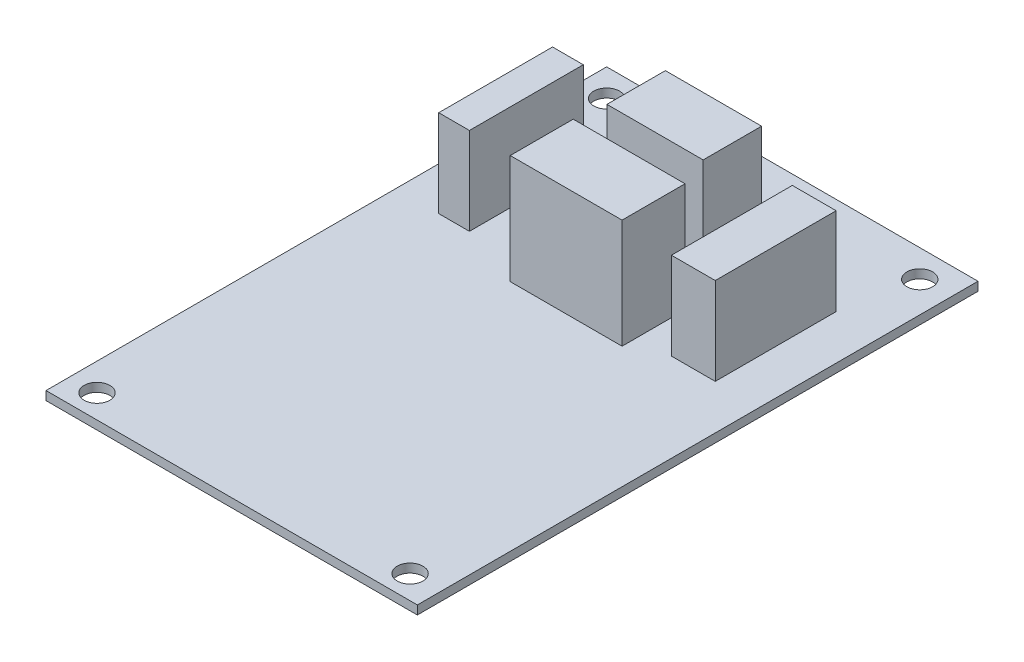
ISO-10303-21;
HEADER;
FILE_DESCRIPTION(('STEP AP214'),'2;1');
FILE_NAME('part.step','',(''),(''),'','','');
FILE_SCHEMA(('AUTOMOTIVE_DESIGN { 1 0 10303 214 1 1 1 1 }'));
ENDSEC;
DATA;
#1=APPLICATION_CONTEXT('core data for automotive mechanical design processes');
#2=APPLICATION_PROTOCOL_DEFINITION('international standard','automotive_design',2000,#1);
#3=PRODUCT_CONTEXT('',#1,'mechanical');
#4=PRODUCT('Part','Part','',(#3));
#5=PRODUCT_RELATED_PRODUCT_CATEGORY('part','',(#4));
#6=PRODUCT_DEFINITION_FORMATION('','',#4);
#7=PRODUCT_DEFINITION_CONTEXT('part definition',#1,'design');
#8=PRODUCT_DEFINITION('design','',#6,#7);
#9=PRODUCT_DEFINITION_SHAPE('','',#8);
#10=(LENGTH_UNIT() NAMED_UNIT(*) SI_UNIT(.MILLI.,.METRE.));
#11=(NAMED_UNIT(*) PLANE_ANGLE_UNIT() SI_UNIT($,.RADIAN.));
#12=(NAMED_UNIT(*) SI_UNIT($,.STERADIAN.) SOLID_ANGLE_UNIT());
#13=UNCERTAINTY_MEASURE_WITH_UNIT(LENGTH_MEASURE(1.E-05),#10,'distance_accuracy_value','');
#14=(GEOMETRIC_REPRESENTATION_CONTEXT(3) GLOBAL_UNCERTAINTY_ASSIGNED_CONTEXT((#13)) GLOBAL_UNIT_ASSIGNED_CONTEXT((#10,
#11,#12)) REPRESENTATION_CONTEXT('',''));
#15=CARTESIAN_POINT('',(0.,0.,0.));
#16=DIRECTION('',(0.,0.,1.));
#17=DIRECTION('',(1.,0.,0.));
#18=AXIS2_PLACEMENT_3D('',#15,#16,#17);
#19=CARTESIAN_POINT('',(0.,1.2,0.));
#20=DIRECTION('',(0.,1.,0.));
#21=DIRECTION('',(0.,0.,1.));
#22=AXIS2_PLACEMENT_3D('',#19,#20,#21);
#23=PLANE('',#22);
#24=CARTESIAN_POINT('',(3.77000000000073,1.2,73.77));
#25=DIRECTION('',(0.,1.,0.));
#26=DIRECTION('',(0.,0.,1.));
#27=AXIS2_PLACEMENT_3D('',#24,#25,#26);
#28=CIRCLE('',#27,1.77);
#29=CARTESIAN_POINT('',(3.77000000000073,1.2,75.54));
#30=VERTEX_POINT('',#29);
#31=EDGE_CURVE('E285',#30,#30,#28,.T.);
#32=ORIENTED_EDGE('',*,*,#31,.F.);
#33=EDGE_LOOP('',(#32));
#34=FACE_BOUND('',#33,.T.);
#35=CARTESIAN_POINT('',(46.7700000000007,1.2,73.77));
#36=DIRECTION('',(0.,1.,0.));
#37=DIRECTION('',(0.,0.,1.));
#38=AXIS2_PLACEMENT_3D('',#35,#36,#37);
#39=CIRCLE('',#38,1.77000000000001);
#40=CARTESIAN_POINT('',(46.7700000000007,1.2,75.54));
#41=VERTEX_POINT('',#40);
#42=EDGE_CURVE('E296',#41,#41,#39,.T.);
#43=ORIENTED_EDGE('',*,*,#42,.F.);
#44=EDGE_LOOP('',(#43));
#45=FACE_BOUND('',#44,.T.);
#46=CARTESIAN_POINT('',(46.77,1.2,3.77));
#47=DIRECTION('',(0.,1.,0.));
#48=DIRECTION('',(0.,0.,1.));
#49=AXIS2_PLACEMENT_3D('',#46,#47,#48);
#50=CIRCLE('',#49,1.77);
#51=CARTESIAN_POINT('',(46.77,1.2,5.54));
#52=VERTEX_POINT('',#51);
#53=EDGE_CURVE('E290',#52,#52,#50,.T.);
#54=ORIENTED_EDGE('',*,*,#53,.F.);
#55=EDGE_LOOP('',(#54));
#56=FACE_BOUND('',#55,.T.);
#57=CARTESIAN_POINT('',(3.77,1.2,3.77));
#58=DIRECTION('',(0.,1.,0.));
#59=DIRECTION('',(0.,0.,1.));
#60=AXIS2_PLACEMENT_3D('',#57,#58,#59);
#61=CIRCLE('',#60,1.77);
#62=CARTESIAN_POINT('',(3.77,1.2,5.54));
#63=VERTEX_POINT('',#62);
#64=EDGE_CURVE('E289',#63,#63,#61,.T.);
#65=ORIENTED_EDGE('',*,*,#64,.F.);
#66=EDGE_LOOP('',(#65));
#67=FACE_BOUND('',#66,.T.);
#68=DIRECTION('',(0.,0.,1.));
#69=VECTOR('',#68,1.);
#70=CARTESIAN_POINT('',(0.,1.2,0.));
#71=LINE('',#70,#69);
#72=CARTESIAN_POINT('',(0.,1.2,0.));
#73=VERTEX_POINT('',#72);
#74=CARTESIAN_POINT('',(0.,1.2,77.));
#75=VERTEX_POINT('',#74);
#76=EDGE_CURVE('E310',#73,#75,#71,.T.);
#77=ORIENTED_EDGE('',*,*,#76,.T.);
#78=DIRECTION('',(1.,0.,0.));
#79=VECTOR('',#78,1.);
#80=CARTESIAN_POINT('',(0.,1.2,77.));
#81=LINE('',#80,#79);
#82=CARTESIAN_POINT('',(51.,1.2,77.));
#83=VERTEX_POINT('',#82);
#84=EDGE_CURVE('E313',#75,#83,#81,.T.);
#85=ORIENTED_EDGE('',*,*,#84,.T.);
#86=DIRECTION('',(0.,0.,-1.));
#87=VECTOR('',#86,1.);
#88=CARTESIAN_POINT('',(51.,1.2,0.));
#89=LINE('',#88,#87);
#90=CARTESIAN_POINT('',(51.,1.2,0.));
#91=VERTEX_POINT('',#90);
#92=EDGE_CURVE('E316',#83,#91,#89,.T.);
#93=ORIENTED_EDGE('',*,*,#92,.T.);
#94=DIRECTION('',(-1.,0.,0.));
#95=VECTOR('',#94,1.);
#96=CARTESIAN_POINT('',(0.,1.2,0.));
#97=LINE('',#96,#95);
#98=EDGE_CURVE('E318',#91,#73,#97,.T.);
#99=ORIENTED_EDGE('',*,*,#98,.T.);
#100=EDGE_LOOP('',(#77,#85,#93,#99));
#101=FACE_BOUND('',#100,.T.);
#102=DIRECTION('',(1.,0.,0.));
#103=VECTOR('',#102,1.);
#104=CARTESIAN_POINT('',(19.4812524808403,1.2,19.4406328559942));
#105=LINE('',#104,#103);
#106=CARTESIAN_POINT('',(19.4812524808403,1.2,19.4406328559942));
#107=VERTEX_POINT('',#106);
#108=CARTESIAN_POINT('',(32.6948246206047,1.2,19.4406328559942));
#109=VERTEX_POINT('',#108);
#110=EDGE_CURVE('E270',#107,#109,#105,.T.);
#111=ORIENTED_EDGE('',*,*,#110,.F.);
#112=DIRECTION('',(0.,0.,1.));
#113=VECTOR('',#112,1.);
#114=CARTESIAN_POINT('',(19.4812524808403,1.2,11.4156361637813));
#115=LINE('',#114,#113);
#116=CARTESIAN_POINT('',(19.4812524808403,1.2,11.4156361637813));
#117=VERTEX_POINT('',#116);
#118=EDGE_CURVE('E256',#117,#107,#115,.T.);
#119=ORIENTED_EDGE('',*,*,#118,.F.);
#120=DIRECTION('',(-1.,0.,0.));
#121=VECTOR('',#120,1.);
#122=CARTESIAN_POINT('',(19.4812524808403,1.2,11.4156361637813));
#123=LINE('',#122,#121);
#124=CARTESIAN_POINT('',(32.6948246206047,1.2,11.4156361637813));
#125=VERTEX_POINT('',#124);
#126=EDGE_CURVE('E261',#125,#117,#123,.T.);
#127=ORIENTED_EDGE('',*,*,#126,.F.);
#128=DIRECTION('',(0.,0.,-1.));
#129=VECTOR('',#128,1.);
#130=CARTESIAN_POINT('',(32.6948246206047,1.2,11.4156361637813));
#131=LINE('',#130,#129);
#132=EDGE_CURVE('E272',#109,#125,#131,.T.);
#133=ORIENTED_EDGE('',*,*,#132,.F.);
#134=EDGE_LOOP('',(#111,#119,#127,#133));
#135=FACE_BOUND('',#134,.T.);
#136=DIRECTION('',(1.,0.,0.));
#137=VECTOR('',#136,1.);
#138=CARTESIAN_POINT('',(18.9278044331014,1.2,32.1699379539872));
#139=LINE('',#138,#137);
#140=CARTESIAN_POINT('',(18.9278044331014,1.2,32.1699379539872));
#141=VERTEX_POINT('',#140);
#142=CARTESIAN_POINT('',(34.2859877578538,1.2,32.1699379539872));
#143=VERTEX_POINT('',#142);
#144=EDGE_CURVE('E241',#141,#143,#139,.T.);
#145=ORIENTED_EDGE('',*,*,#144,.F.);
#146=DIRECTION('',(0.,0.,1.));
#147=VECTOR('',#146,1.);
#148=CARTESIAN_POINT('',(18.9278044331014,1.2,23.5223122080681));
#149=LINE('',#148,#147);
#150=CARTESIAN_POINT('',(18.9278044331014,1.2,23.5223122080681));
#151=VERTEX_POINT('',#150);
#152=EDGE_CURVE('E227',#151,#141,#149,.T.);
#153=ORIENTED_EDGE('',*,*,#152,.F.);
#154=DIRECTION('',(-1.,0.,0.));
#155=VECTOR('',#154,1.);
#156=CARTESIAN_POINT('',(18.9278044331014,1.2,23.5223122080681));
#157=LINE('',#156,#155);
#158=CARTESIAN_POINT('',(34.2859877578538,1.2,23.5223122080681));
#159=VERTEX_POINT('',#158);
#160=EDGE_CURVE('E232',#159,#151,#157,.T.);
#161=ORIENTED_EDGE('',*,*,#160,.F.);
#162=DIRECTION('',(0.,0.,-1.));
#163=VECTOR('',#162,1.);
#164=CARTESIAN_POINT('',(34.2859877578538,1.2,23.5223122080681));
#165=LINE('',#164,#163);
#166=EDGE_CURVE('E243',#143,#159,#165,.T.);
#167=ORIENTED_EDGE('',*,*,#166,.F.);
#168=EDGE_LOOP('',(#145,#153,#161,#167));
#169=FACE_BOUND('',#168,.T.);
#170=DIRECTION('',(1.,0.,0.));
#171=VECTOR('',#170,1.);
#172=CARTESIAN_POINT('',(5.92177531123907,1.2,28.987611679489));
#173=LINE('',#172,#171);
#174=CARTESIAN_POINT('',(5.92177531123907,1.2,28.987611679489));
#175=VERTEX_POINT('',#174);
#176=CARTESIAN_POINT('',(10.1418166752476,1.2,28.987611679489));
#177=VERTEX_POINT('',#176);
#178=EDGE_CURVE('E199',#175,#177,#173,.T.);
#179=ORIENTED_EDGE('',*,*,#178,.F.);
#180=DIRECTION('',(0.,0.,1.));
#181=VECTOR('',#180,1.);
#182=CARTESIAN_POINT('',(5.92177531123907,1.2,13.3527043308672));
#183=LINE('',#182,#181);
#184=CARTESIAN_POINT('',(5.92177531123907,1.2,13.3527043308672));
#185=VERTEX_POINT('',#184);
#186=EDGE_CURVE('E196',#185,#175,#183,.T.);
#187=ORIENTED_EDGE('',*,*,#186,.F.);
#188=DIRECTION('',(-1.,0.,0.));
#189=VECTOR('',#188,1.);
#190=CARTESIAN_POINT('',(5.92177531123907,1.2,13.3527043308672));
#191=LINE('',#190,#189);
#192=CARTESIAN_POINT('',(10.1418166752476,1.2,13.3527043308672));
#193=VERTEX_POINT('',#192);
#194=EDGE_CURVE('E208',#193,#185,#191,.T.);
#195=ORIENTED_EDGE('',*,*,#194,.F.);
#196=DIRECTION('',(0.,0.,-1.));
#197=VECTOR('',#196,1.);
#198=CARTESIAN_POINT('',(10.1418166752476,1.2,13.3527043308672));
#199=LINE('',#198,#197);
#200=EDGE_CURVE('E216',#177,#193,#199,.T.);
#201=ORIENTED_EDGE('',*,*,#200,.F.);
#202=EDGE_LOOP('',(#179,#187,#195,#201));
#203=FACE_BOUND('',#202,.T.);
#204=DIRECTION('',(1.,0.,0.));
#205=VECTOR('',#204,1.);
#206=CARTESIAN_POINT('',(38.8519341516991,1.2,29.9561457630319));
#207=LINE('',#206,#205);
#208=CARTESIAN_POINT('',(38.8519341516991,1.2,29.9561457630319));
#209=VERTEX_POINT('',#208);
#210=CARTESIAN_POINT('',(44.8706816708589,1.2,29.9561457630319));
#211=VERTEX_POINT('',#210);
#212=EDGE_CURVE('E597',#209,#211,#207,.T.);
#213=ORIENTED_EDGE('',*,*,#212,.F.);
#214=DIRECTION('',(0.,0.,1.));
#215=VECTOR('',#214,1.);
#216=CARTESIAN_POINT('',(38.8519341516991,1.2,13.3527043308672));
#217=LINE('',#216,#215);
#218=CARTESIAN_POINT('',(38.8519341516991,1.2,13.3527043308672));
#219=VERTEX_POINT('',#218);
#220=EDGE_CURVE('E194',#219,#209,#217,.T.);
#221=ORIENTED_EDGE('',*,*,#220,.F.);
#222=DIRECTION('',(-1.,0.,0.));
#223=VECTOR('',#222,1.);
#224=CARTESIAN_POINT('',(38.8519341516991,1.2,13.3527043308672));
#225=LINE('',#224,#223);
#226=CARTESIAN_POINT('',(44.8706816708589,1.2,13.3527043308672));
#227=VERTEX_POINT('',#226);
#228=EDGE_CURVE('E190',#227,#219,#225,.T.);
#229=ORIENTED_EDGE('',*,*,#228,.F.);
#230=DIRECTION('',(0.,0.,-1.));
#231=VECTOR('',#230,1.);
#232=CARTESIAN_POINT('',(44.8706816708589,1.2,13.3527043308672));
#233=LINE('',#232,#231);
#234=EDGE_CURVE('E594',#211,#227,#233,.T.);
#235=ORIENTED_EDGE('',*,*,#234,.F.);
#236=EDGE_LOOP('',(#213,#221,#229,#235));
#237=FACE_BOUND('',#236,.T.);
#238=ADVANCED_FACE('F33',(#34,#45,#56,#67,#101,#135,#169,#203,#237),#23,.T.);
#239=CARTESIAN_POINT('',(0.,1.2,0.));
#240=DIRECTION('',(1.,0.,0.));
#241=DIRECTION('',(0.,0.,-1.));
#242=AXIS2_PLACEMENT_3D('',#239,#240,#241);
#243=PLANE('',#242);
#244=DIRECTION('',(0.,0.,1.));
#245=VECTOR('',#244,1.);
#246=CARTESIAN_POINT('',(0.,0.,0.));
#247=LINE('',#246,#245);
#248=CARTESIAN_POINT('',(0.,0.,0.));
#249=VERTEX_POINT('',#248);
#250=CARTESIAN_POINT('',(0.,0.,77.));
#251=VERTEX_POINT('',#250);
#252=EDGE_CURVE('E307',#249,#251,#247,.T.);
#253=ORIENTED_EDGE('',*,*,#252,.T.);
#254=DIRECTION('',(0.,-1.,0.));
#255=VECTOR('',#254,1.);
#256=CARTESIAN_POINT('',(0.,1.2,77.));
#257=LINE('',#256,#255);
#258=EDGE_CURVE('E11',#75,#251,#257,.T.);
#259=ORIENTED_EDGE('',*,*,#258,.F.);
#260=ORIENTED_EDGE('',*,*,#76,.F.);
#261=DIRECTION('',(0.,-1.,0.));
#262=VECTOR('',#261,1.);
#263=CARTESIAN_POINT('',(0.,1.2,0.));
#264=LINE('',#263,#262);
#265=EDGE_CURVE('E320',#73,#249,#264,.T.);
#266=ORIENTED_EDGE('',*,*,#265,.T.);
#267=EDGE_LOOP('',(#253,#259,#260,#266));
#268=FACE_BOUND('',#267,.T.);
#269=ADVANCED_FACE('F35',(#268),#243,.F.);
#270=CARTESIAN_POINT('',(0.,1.2,77.));
#271=DIRECTION('',(0.,0.,-1.));
#272=DIRECTION('',(-1.,0.,0.));
#273=AXIS2_PLACEMENT_3D('',#270,#271,#272);
#274=PLANE('',#273);
#275=DIRECTION('',(1.,0.,0.));
#276=VECTOR('',#275,1.);
#277=CARTESIAN_POINT('',(0.,0.,77.));
#278=LINE('',#277,#276);
#279=CARTESIAN_POINT('',(51.,0.,77.));
#280=VERTEX_POINT('',#279);
#281=EDGE_CURVE('E323',#251,#280,#278,.T.);
#282=ORIENTED_EDGE('',*,*,#281,.T.);
#283=DIRECTION('',(0.,-1.,0.));
#284=VECTOR('',#283,1.);
#285=CARTESIAN_POINT('',(51.,1.2,77.));
#286=LINE('',#285,#284);
#287=EDGE_CURVE('E41',#83,#280,#286,.T.);
#288=ORIENTED_EDGE('',*,*,#287,.F.);
#289=ORIENTED_EDGE('',*,*,#84,.F.);
#290=ORIENTED_EDGE('',*,*,#258,.T.);
#291=EDGE_LOOP('',(#282,#288,#289,#290));
#292=FACE_BOUND('',#291,.T.);
#293=ADVANCED_FACE('F353',(#292),#274,.F.);
#294=CARTESIAN_POINT('',(51.,1.2,0.));
#295=DIRECTION('',(-1.,0.,0.));
#296=DIRECTION('',(0.,0.,1.));
#297=AXIS2_PLACEMENT_3D('',#294,#295,#296);
#298=PLANE('',#297);
#299=DIRECTION('',(0.,0.,-1.));
#300=VECTOR('',#299,1.);
#301=CARTESIAN_POINT('',(51.,0.,0.));
#302=LINE('',#301,#300);
#303=CARTESIAN_POINT('',(51.,0.,0.));
#304=VERTEX_POINT('',#303);
#305=EDGE_CURVE('E325',#280,#304,#302,.T.);
#306=ORIENTED_EDGE('',*,*,#305,.T.);
#307=DIRECTION('',(0.,-1.,0.));
#308=VECTOR('',#307,1.);
#309=CARTESIAN_POINT('',(51.,1.2,0.));
#310=LINE('',#309,#308);
#311=EDGE_CURVE('E330',#91,#304,#310,.T.);
#312=ORIENTED_EDGE('',*,*,#311,.F.);
#313=ORIENTED_EDGE('',*,*,#92,.F.);
#314=ORIENTED_EDGE('',*,*,#287,.T.);
#315=EDGE_LOOP('',(#306,#312,#313,#314));
#316=FACE_BOUND('',#315,.T.);
#317=ADVANCED_FACE('F337',(#316),#298,.F.);
#318=CARTESIAN_POINT('',(0.,1.2,0.));
#319=DIRECTION('',(0.,0.,1.));
#320=DIRECTION('',(1.,0.,0.));
#321=AXIS2_PLACEMENT_3D('',#318,#319,#320);
#322=PLANE('',#321);
#323=DIRECTION('',(-1.,0.,0.));
#324=VECTOR('',#323,1.);
#325=CARTESIAN_POINT('',(0.,0.,0.));
#326=LINE('',#325,#324);
#327=EDGE_CURVE('E314',#304,#249,#326,.T.);
#328=ORIENTED_EDGE('',*,*,#327,.T.);
#329=ORIENTED_EDGE('',*,*,#265,.F.);
#330=ORIENTED_EDGE('',*,*,#98,.F.);
#331=ORIENTED_EDGE('',*,*,#311,.T.);
#332=EDGE_LOOP('',(#328,#329,#330,#331));
#333=FACE_BOUND('',#332,.T.);
#334=ADVANCED_FACE('F346',(#333),#322,.F.);
#335=CARTESIAN_POINT('',(0.,0.,0.));
#336=DIRECTION('',(0.,1.,0.));
#337=DIRECTION('',(0.,0.,1.));
#338=AXIS2_PLACEMENT_3D('',#335,#336,#337);
#339=PLANE('',#338);
#340=CARTESIAN_POINT('',(3.77000000000073,0.,73.77));
#341=DIRECTION('',(0.,1.,0.));
#342=DIRECTION('',(0.,0.,1.));
#343=AXIS2_PLACEMENT_3D('',#340,#341,#342);
#344=CIRCLE('',#343,1.77);
#345=CARTESIAN_POINT('',(3.77000000000073,0.,75.54));
#346=VERTEX_POINT('',#345);
#347=EDGE_CURVE('E299',#346,#346,#344,.T.);
#348=ORIENTED_EDGE('',*,*,#347,.T.);
#349=EDGE_LOOP('',(#348));
#350=FACE_BOUND('',#349,.T.);
#351=CARTESIAN_POINT('',(46.7700000000007,0.,73.77));
#352=DIRECTION('',(0.,1.,0.));
#353=DIRECTION('',(0.,0.,1.));
#354=AXIS2_PLACEMENT_3D('',#351,#352,#353);
#355=CIRCLE('',#354,1.77000000000001);
#356=CARTESIAN_POINT('',(46.7700000000007,0.,75.54));
#357=VERTEX_POINT('',#356);
#358=EDGE_CURVE('E293',#357,#357,#355,.T.);
#359=ORIENTED_EDGE('',*,*,#358,.T.);
#360=EDGE_LOOP('',(#359));
#361=FACE_BOUND('',#360,.T.);
#362=CARTESIAN_POINT('',(46.77,0.,3.77));
#363=DIRECTION('',(0.,1.,0.));
#364=DIRECTION('',(0.,0.,1.));
#365=AXIS2_PLACEMENT_3D('',#362,#363,#364);
#366=CIRCLE('',#365,1.77);
#367=CARTESIAN_POINT('',(46.77,0.,5.54));
#368=VERTEX_POINT('',#367);
#369=EDGE_CURVE('E286',#368,#368,#366,.T.);
#370=ORIENTED_EDGE('',*,*,#369,.T.);
#371=EDGE_LOOP('',(#370));
#372=FACE_BOUND('',#371,.T.);
#373=CARTESIAN_POINT('',(3.77,0.,3.77));
#374=DIRECTION('',(0.,1.,0.));
#375=DIRECTION('',(0.,0.,1.));
#376=AXIS2_PLACEMENT_3D('',#373,#374,#375);
#377=CIRCLE('',#376,1.77);
#378=CARTESIAN_POINT('',(3.77,0.,5.54));
#379=VERTEX_POINT('',#378);
#380=EDGE_CURVE('E304',#379,#379,#377,.T.);
#381=ORIENTED_EDGE('',*,*,#380,.T.);
#382=EDGE_LOOP('',(#381));
#383=FACE_BOUND('',#382,.T.);
#384=ORIENTED_EDGE('',*,*,#252,.F.);
#385=ORIENTED_EDGE('',*,*,#327,.F.);
#386=ORIENTED_EDGE('',*,*,#305,.F.);
#387=ORIENTED_EDGE('',*,*,#281,.F.);
#388=EDGE_LOOP('',(#384,#385,#386,#387));
#389=FACE_BOUND('',#388,.T.);
#390=ADVANCED_FACE('F343',(#350,#361,#372,#383,#389),#339,.F.);
#391=CARTESIAN_POINT('',(3.77,0.,3.77));
#392=DIRECTION('',(0.,1.,0.));
#393=DIRECTION('',(0.,0.,1.));
#394=AXIS2_PLACEMENT_3D('',#391,#392,#393);
#395=CYLINDRICAL_SURFACE('',#394,1.77);
#396=ORIENTED_EDGE('',*,*,#380,.F.);
#397=EDGE_LOOP('',(#396));
#398=FACE_BOUND('',#397,.T.);
#399=ORIENTED_EDGE('',*,*,#64,.T.);
#400=EDGE_LOOP('',(#399));
#401=FACE_BOUND('',#400,.T.);
#402=ADVANCED_FACE('F371',(#398,#401),#395,.F.);
#403=CARTESIAN_POINT('',(46.77,0.,3.77));
#404=DIRECTION('',(0.,1.,0.));
#405=DIRECTION('',(0.,0.,1.));
#406=AXIS2_PLACEMENT_3D('',#403,#404,#405);
#407=CYLINDRICAL_SURFACE('',#406,1.77);
#408=ORIENTED_EDGE('',*,*,#369,.F.);
#409=EDGE_LOOP('',(#408));
#410=FACE_BOUND('',#409,.T.);
#411=ORIENTED_EDGE('',*,*,#53,.T.);
#412=EDGE_LOOP('',(#411));
#413=FACE_BOUND('',#412,.T.);
#414=ADVANCED_FACE('F391',(#410,#413),#407,.F.);
#415=CARTESIAN_POINT('',(46.7700000000007,0.,73.77));
#416=DIRECTION('',(0.,1.,0.));
#417=DIRECTION('',(0.,0.,1.));
#418=AXIS2_PLACEMENT_3D('',#415,#416,#417);
#419=CYLINDRICAL_SURFACE('',#418,1.77000000000001);
#420=ORIENTED_EDGE('',*,*,#358,.F.);
#421=EDGE_LOOP('',(#420));
#422=FACE_BOUND('',#421,.T.);
#423=ORIENTED_EDGE('',*,*,#42,.T.);
#424=EDGE_LOOP('',(#423));
#425=FACE_BOUND('',#424,.T.);
#426=ADVANCED_FACE('F398',(#422,#425),#419,.F.);
#427=CARTESIAN_POINT('',(3.77000000000073,0.,73.77));
#428=DIRECTION('',(0.,1.,0.));
#429=DIRECTION('',(0.,0.,1.));
#430=AXIS2_PLACEMENT_3D('',#427,#428,#429);
#431=CYLINDRICAL_SURFACE('',#430,1.77);
#432=ORIENTED_EDGE('',*,*,#347,.F.);
#433=EDGE_LOOP('',(#432));
#434=FACE_BOUND('',#433,.T.);
#435=ORIENTED_EDGE('',*,*,#31,.T.);
#436=EDGE_LOOP('',(#435));
#437=FACE_BOUND('',#436,.T.);
#438=ADVANCED_FACE('F406',(#434,#437),#431,.F.);
#439=CARTESIAN_POINT('',(19.4812524808403,16.2,11.4156361637813));
#440=DIRECTION('',(1.,0.,0.));
#441=DIRECTION('',(0.,0.,-1.));
#442=AXIS2_PLACEMENT_3D('',#439,#440,#441);
#443=PLANE('',#442);
#444=ORIENTED_EDGE('',*,*,#118,.T.);
#445=DIRECTION('',(0.,-1.,0.));
#446=VECTOR('',#445,1.);
#447=CARTESIAN_POINT('',(19.4812524808403,16.2,19.4406328559942));
#448=LINE('',#447,#446);
#449=CARTESIAN_POINT('',(19.4812524808403,16.2,19.4406328559942));
#450=VERTEX_POINT('',#449);
#451=EDGE_CURVE('E283',#450,#107,#448,.T.);
#452=ORIENTED_EDGE('',*,*,#451,.F.);
#453=DIRECTION('',(0.,0.,1.));
#454=VECTOR('',#453,1.);
#455=CARTESIAN_POINT('',(19.4812524808403,16.2,11.4156361637813));
#456=LINE('',#455,#454);
#457=CARTESIAN_POINT('',(19.4812524808403,16.2,11.4156361637813));
#458=VERTEX_POINT('',#457);
#459=EDGE_CURVE('E257',#458,#450,#456,.T.);
#460=ORIENTED_EDGE('',*,*,#459,.F.);
#461=DIRECTION('',(0.,-1.,0.));
#462=VECTOR('',#461,1.);
#463=CARTESIAN_POINT('',(19.4812524808403,16.2,11.4156361637813));
#464=LINE('',#463,#462);
#465=EDGE_CURVE('E267',#458,#117,#464,.T.);
#466=ORIENTED_EDGE('',*,*,#465,.T.);
#467=EDGE_LOOP('',(#444,#452,#460,#466));
#468=FACE_BOUND('',#467,.T.);
#469=ADVANCED_FACE('F413',(#468),#443,.F.);
#470=CARTESIAN_POINT('',(19.4812524808403,16.2,19.4406328559942));
#471=DIRECTION('',(0.,0.,-1.));
#472=DIRECTION('',(-1.,0.,0.));
#473=AXIS2_PLACEMENT_3D('',#470,#471,#472);
#474=PLANE('',#473);
#475=ORIENTED_EDGE('',*,*,#110,.T.);
#476=DIRECTION('',(0.,-1.,0.));
#477=VECTOR('',#476,1.);
#478=CARTESIAN_POINT('',(32.6948246206047,16.2,19.4406328559942));
#479=LINE('',#478,#477);
#480=CARTESIAN_POINT('',(32.6948246206047,16.2,19.4406328559942));
#481=VERTEX_POINT('',#480);
#482=EDGE_CURVE('E280',#481,#109,#479,.T.);
#483=ORIENTED_EDGE('',*,*,#482,.F.);
#484=DIRECTION('',(1.,0.,0.));
#485=VECTOR('',#484,1.);
#486=CARTESIAN_POINT('',(19.4812524808403,16.2,19.4406328559942));
#487=LINE('',#486,#485);
#488=EDGE_CURVE('E260',#450,#481,#487,.T.);
#489=ORIENTED_EDGE('',*,*,#488,.F.);
#490=ORIENTED_EDGE('',*,*,#451,.T.);
#491=EDGE_LOOP('',(#475,#483,#489,#490));
#492=FACE_BOUND('',#491,.T.);
#493=ADVANCED_FACE('F427',(#492),#474,.F.);
#494=CARTESIAN_POINT('',(32.6948246206047,16.2,11.4156361637813));
#495=DIRECTION('',(-1.,0.,0.));
#496=DIRECTION('',(0.,0.,1.));
#497=AXIS2_PLACEMENT_3D('',#494,#495,#496);
#498=PLANE('',#497);
#499=ORIENTED_EDGE('',*,*,#132,.T.);
#500=DIRECTION('',(0.,-1.,0.));
#501=VECTOR('',#500,1.);
#502=CARTESIAN_POINT('',(32.6948246206047,16.2,11.4156361637813));
#503=LINE('',#502,#501);
#504=CARTESIAN_POINT('',(32.6948246206047,16.2,11.4156361637813));
#505=VERTEX_POINT('',#504);
#506=EDGE_CURVE('E278',#505,#125,#503,.T.);
#507=ORIENTED_EDGE('',*,*,#506,.F.);
#508=DIRECTION('',(0.,0.,-1.));
#509=VECTOR('',#508,1.);
#510=CARTESIAN_POINT('',(32.6948246206047,16.2,11.4156361637813));
#511=LINE('',#510,#509);
#512=EDGE_CURVE('E263',#481,#505,#511,.T.);
#513=ORIENTED_EDGE('',*,*,#512,.F.);
#514=ORIENTED_EDGE('',*,*,#482,.T.);
#515=EDGE_LOOP('',(#499,#507,#513,#514));
#516=FACE_BOUND('',#515,.T.);
#517=ADVANCED_FACE('F435',(#516),#498,.F.);
#518=CARTESIAN_POINT('',(19.4812524808403,16.2,11.4156361637813));
#519=DIRECTION('',(0.,0.,1.));
#520=DIRECTION('',(1.,0.,0.));
#521=AXIS2_PLACEMENT_3D('',#518,#519,#520);
#522=PLANE('',#521);
#523=ORIENTED_EDGE('',*,*,#126,.T.);
#524=ORIENTED_EDGE('',*,*,#465,.F.);
#525=DIRECTION('',(-1.,0.,0.));
#526=VECTOR('',#525,1.);
#527=CARTESIAN_POINT('',(19.4812524808403,16.2,11.4156361637813));
#528=LINE('',#527,#526);
#529=EDGE_CURVE('E265',#505,#458,#528,.T.);
#530=ORIENTED_EDGE('',*,*,#529,.F.);
#531=ORIENTED_EDGE('',*,*,#506,.T.);
#532=EDGE_LOOP('',(#523,#524,#530,#531));
#533=FACE_BOUND('',#532,.T.);
#534=ADVANCED_FACE('F443',(#533),#522,.F.);
#535=CARTESIAN_POINT('',(0.,16.2,0.));
#536=DIRECTION('',(0.,1.,0.));
#537=DIRECTION('',(0.,0.,1.));
#538=AXIS2_PLACEMENT_3D('',#535,#536,#537);
#539=PLANE('',#538);
#540=ORIENTED_EDGE('',*,*,#459,.T.);
#541=ORIENTED_EDGE('',*,*,#488,.T.);
#542=ORIENTED_EDGE('',*,*,#512,.T.);
#543=ORIENTED_EDGE('',*,*,#529,.T.);
#544=EDGE_LOOP('',(#540,#541,#542,#543));
#545=FACE_BOUND('',#544,.T.);
#546=ADVANCED_FACE('F451',(#545),#539,.T.);
#547=CARTESIAN_POINT('',(18.9278044331014,16.2,23.5223122080681));
#548=DIRECTION('',(1.,0.,0.));
#549=DIRECTION('',(0.,0.,-1.));
#550=AXIS2_PLACEMENT_3D('',#547,#548,#549);
#551=PLANE('',#550);
#552=ORIENTED_EDGE('',*,*,#152,.T.);
#553=DIRECTION('',(0.,-1.,0.));
#554=VECTOR('',#553,1.);
#555=CARTESIAN_POINT('',(18.9278044331014,16.2,32.1699379539872));
#556=LINE('',#555,#554);
#557=CARTESIAN_POINT('',(18.9278044331014,16.2,32.1699379539872));
#558=VERTEX_POINT('',#557);
#559=EDGE_CURVE('E254',#558,#141,#556,.T.);
#560=ORIENTED_EDGE('',*,*,#559,.F.);
#561=DIRECTION('',(0.,0.,1.));
#562=VECTOR('',#561,1.);
#563=CARTESIAN_POINT('',(18.9278044331014,16.2,23.5223122080681));
#564=LINE('',#563,#562);
#565=CARTESIAN_POINT('',(18.9278044331014,16.2,23.5223122080681));
#566=VERTEX_POINT('',#565);
#567=EDGE_CURVE('E228',#566,#558,#564,.T.);
#568=ORIENTED_EDGE('',*,*,#567,.F.);
#569=DIRECTION('',(0.,-1.,0.));
#570=VECTOR('',#569,1.);
#571=CARTESIAN_POINT('',(18.9278044331014,16.2,23.5223122080681));
#572=LINE('',#571,#570);
#573=EDGE_CURVE('E238',#566,#151,#572,.T.);
#574=ORIENTED_EDGE('',*,*,#573,.T.);
#575=EDGE_LOOP('',(#552,#560,#568,#574));
#576=FACE_BOUND('',#575,.T.);
#577=ADVANCED_FACE('F459',(#576),#551,.F.);
#578=CARTESIAN_POINT('',(18.9278044331014,16.2,32.1699379539872));
#579=DIRECTION('',(0.,0.,-1.));
#580=DIRECTION('',(-1.,0.,0.));
#581=AXIS2_PLACEMENT_3D('',#578,#579,#580);
#582=PLANE('',#581);
#583=ORIENTED_EDGE('',*,*,#144,.T.);
#584=DIRECTION('',(0.,-1.,0.));
#585=VECTOR('',#584,1.);
#586=CARTESIAN_POINT('',(34.2859877578538,16.2,32.1699379539872));
#587=LINE('',#586,#585);
#588=CARTESIAN_POINT('',(34.2859877578538,16.2,32.1699379539872));
#589=VERTEX_POINT('',#588);
#590=EDGE_CURVE('E251',#589,#143,#587,.T.);
#591=ORIENTED_EDGE('',*,*,#590,.F.);
#592=DIRECTION('',(1.,0.,0.));
#593=VECTOR('',#592,1.);
#594=CARTESIAN_POINT('',(18.9278044331014,16.2,32.1699379539872));
#595=LINE('',#594,#593);
#596=EDGE_CURVE('E231',#558,#589,#595,.T.);
#597=ORIENTED_EDGE('',*,*,#596,.F.);
#598=ORIENTED_EDGE('',*,*,#559,.T.);
#599=EDGE_LOOP('',(#583,#591,#597,#598));
#600=FACE_BOUND('',#599,.T.);
#601=ADVANCED_FACE('F467',(#600),#582,.F.);
#602=CARTESIAN_POINT('',(34.2859877578538,16.2,23.5223122080681));
#603=DIRECTION('',(-1.,0.,0.));
#604=DIRECTION('',(0.,0.,1.));
#605=AXIS2_PLACEMENT_3D('',#602,#603,#604);
#606=PLANE('',#605);
#607=ORIENTED_EDGE('',*,*,#166,.T.);
#608=DIRECTION('',(0.,-1.,0.));
#609=VECTOR('',#608,1.);
#610=CARTESIAN_POINT('',(34.2859877578538,16.2,23.5223122080681));
#611=LINE('',#610,#609);
#612=CARTESIAN_POINT('',(34.2859877578538,16.2,23.5223122080681));
#613=VERTEX_POINT('',#612);
#614=EDGE_CURVE('E249',#613,#159,#611,.T.);
#615=ORIENTED_EDGE('',*,*,#614,.F.);
#616=DIRECTION('',(0.,0.,-1.));
#617=VECTOR('',#616,1.);
#618=CARTESIAN_POINT('',(34.2859877578538,16.2,23.5223122080681));
#619=LINE('',#618,#617);
#620=EDGE_CURVE('E234',#589,#613,#619,.T.);
#621=ORIENTED_EDGE('',*,*,#620,.F.);
#622=ORIENTED_EDGE('',*,*,#590,.T.);
#623=EDGE_LOOP('',(#607,#615,#621,#622));
#624=FACE_BOUND('',#623,.T.);
#625=ADVANCED_FACE('F475',(#624),#606,.F.);
#626=CARTESIAN_POINT('',(18.9278044331014,16.2,23.5223122080681));
#627=DIRECTION('',(0.,0.,1.));
#628=DIRECTION('',(1.,0.,0.));
#629=AXIS2_PLACEMENT_3D('',#626,#627,#628);
#630=PLANE('',#629);
#631=ORIENTED_EDGE('',*,*,#160,.T.);
#632=ORIENTED_EDGE('',*,*,#573,.F.);
#633=DIRECTION('',(-1.,0.,0.));
#634=VECTOR('',#633,1.);
#635=CARTESIAN_POINT('',(18.9278044331014,16.2,23.5223122080681));
#636=LINE('',#635,#634);
#637=EDGE_CURVE('E236',#613,#566,#636,.T.);
#638=ORIENTED_EDGE('',*,*,#637,.F.);
#639=ORIENTED_EDGE('',*,*,#614,.T.);
#640=EDGE_LOOP('',(#631,#632,#638,#639));
#641=FACE_BOUND('',#640,.T.);
#642=ADVANCED_FACE('F483',(#641),#630,.F.);
#643=CARTESIAN_POINT('',(0.,16.2,0.));
#644=DIRECTION('',(0.,1.,0.));
#645=DIRECTION('',(0.,0.,1.));
#646=AXIS2_PLACEMENT_3D('',#643,#644,#645);
#647=PLANE('',#646);
#648=ORIENTED_EDGE('',*,*,#567,.T.);
#649=ORIENTED_EDGE('',*,*,#596,.T.);
#650=ORIENTED_EDGE('',*,*,#620,.T.);
#651=ORIENTED_EDGE('',*,*,#637,.T.);
#652=EDGE_LOOP('',(#648,#649,#650,#651));
#653=FACE_BOUND('',#652,.T.);
#654=ADVANCED_FACE('F491',(#653),#647,.T.);
#655=CARTESIAN_POINT('',(5.92177531123907,13.2,13.3527043308672));
#656=DIRECTION('',(1.,0.,0.));
#657=DIRECTION('',(0.,0.,-1.));
#658=AXIS2_PLACEMENT_3D('',#655,#656,#657);
#659=PLANE('',#658);
#660=ORIENTED_EDGE('',*,*,#186,.T.);
#661=DIRECTION('',(0.,-1.,0.));
#662=VECTOR('',#661,1.);
#663=CARTESIAN_POINT('',(5.92177531123907,13.2,28.987611679489));
#664=LINE('',#663,#662);
#665=CARTESIAN_POINT('',(5.92177531123907,13.2,28.987611679489));
#666=VERTEX_POINT('',#665);
#667=EDGE_CURVE('E225',#666,#175,#664,.T.);
#668=ORIENTED_EDGE('',*,*,#667,.F.);
#669=DIRECTION('',(0.,0.,1.));
#670=VECTOR('',#669,1.);
#671=CARTESIAN_POINT('',(5.92177531123907,13.2,13.3527043308672));
#672=LINE('',#671,#670);
#673=CARTESIAN_POINT('',(5.92177531123907,13.2,13.3527043308672));
#674=VERTEX_POINT('',#673);
#675=EDGE_CURVE('E204',#674,#666,#672,.T.);
#676=ORIENTED_EDGE('',*,*,#675,.F.);
#677=DIRECTION('',(0.,-1.,0.));
#678=VECTOR('',#677,1.);
#679=CARTESIAN_POINT('',(5.92177531123907,13.2,13.3527043308672));
#680=LINE('',#679,#678);
#681=EDGE_CURVE('E213',#674,#185,#680,.T.);
#682=ORIENTED_EDGE('',*,*,#681,.T.);
#683=EDGE_LOOP('',(#660,#668,#676,#682));
#684=FACE_BOUND('',#683,.T.);
#685=ADVANCED_FACE('F498',(#684),#659,.F.);
#686=CARTESIAN_POINT('',(5.92177531123907,13.2,28.987611679489));
#687=DIRECTION('',(0.,0.,-1.));
#688=DIRECTION('',(-1.,0.,0.));
#689=AXIS2_PLACEMENT_3D('',#686,#687,#688);
#690=PLANE('',#689);
#691=ORIENTED_EDGE('',*,*,#178,.T.);
#692=DIRECTION('',(0.,-1.,0.));
#693=VECTOR('',#692,1.);
#694=CARTESIAN_POINT('',(10.1418166752476,13.2,28.987611679489));
#695=LINE('',#694,#693);
#696=CARTESIAN_POINT('',(10.1418166752476,13.2,28.987611679489));
#697=VERTEX_POINT('',#696);
#698=EDGE_CURVE('E222',#697,#177,#695,.T.);
#699=ORIENTED_EDGE('',*,*,#698,.F.);
#700=DIRECTION('',(1.,0.,0.));
#701=VECTOR('',#700,1.);
#702=CARTESIAN_POINT('',(5.92177531123907,13.2,28.987611679489));
#703=LINE('',#702,#701);
#704=EDGE_CURVE('E207',#666,#697,#703,.T.);
#705=ORIENTED_EDGE('',*,*,#704,.F.);
#706=ORIENTED_EDGE('',*,*,#667,.T.);
#707=EDGE_LOOP('',(#691,#699,#705,#706));
#708=FACE_BOUND('',#707,.T.);
#709=ADVANCED_FACE('F504',(#708),#690,.F.);
#710=CARTESIAN_POINT('',(10.1418166752476,13.2,13.3527043308672));
#711=DIRECTION('',(-1.,0.,0.));
#712=DIRECTION('',(0.,0.,1.));
#713=AXIS2_PLACEMENT_3D('',#710,#711,#712);
#714=PLANE('',#713);
#715=ORIENTED_EDGE('',*,*,#200,.T.);
#716=DIRECTION('',(0.,-1.,0.));
#717=VECTOR('',#716,1.);
#718=CARTESIAN_POINT('',(10.1418166752476,13.2,13.3527043308672));
#719=LINE('',#718,#717);
#720=CARTESIAN_POINT('',(10.1418166752476,13.2,13.3527043308672));
#721=VERTEX_POINT('',#720);
#722=EDGE_CURVE('E56',#721,#193,#719,.T.);
#723=ORIENTED_EDGE('',*,*,#722,.F.);
#724=DIRECTION('',(0.,0.,-1.));
#725=VECTOR('',#724,1.);
#726=CARTESIAN_POINT('',(10.1418166752476,13.2,13.3527043308672));
#727=LINE('',#726,#725);
#728=EDGE_CURVE('E210',#697,#721,#727,.T.);
#729=ORIENTED_EDGE('',*,*,#728,.F.);
#730=ORIENTED_EDGE('',*,*,#698,.T.);
#731=EDGE_LOOP('',(#715,#723,#729,#730));
#732=FACE_BOUND('',#731,.T.);
#733=ADVANCED_FACE('F511',(#732),#714,.F.);
#734=CARTESIAN_POINT('',(5.92177531123907,13.2,13.3527043308672));
#735=DIRECTION('',(0.,0.,1.));
#736=DIRECTION('',(1.,0.,0.));
#737=AXIS2_PLACEMENT_3D('',#734,#735,#736);
#738=PLANE('',#737);
#739=ORIENTED_EDGE('',*,*,#194,.T.);
#740=ORIENTED_EDGE('',*,*,#681,.F.);
#741=DIRECTION('',(-1.,0.,0.));
#742=VECTOR('',#741,1.);
#743=CARTESIAN_POINT('',(5.92177531123907,13.2,13.3527043308672));
#744=LINE('',#743,#742);
#745=EDGE_CURVE('E212',#721,#674,#744,.T.);
#746=ORIENTED_EDGE('',*,*,#745,.F.);
#747=ORIENTED_EDGE('',*,*,#722,.T.);
#748=EDGE_LOOP('',(#739,#740,#746,#747));
#749=FACE_BOUND('',#748,.T.);
#750=ADVANCED_FACE('F519',(#749),#738,.F.);
#751=CARTESIAN_POINT('',(0.,13.2,0.));
#752=DIRECTION('',(0.,1.,0.));
#753=DIRECTION('',(0.,0.,1.));
#754=AXIS2_PLACEMENT_3D('',#751,#752,#753);
#755=PLANE('',#754);
#756=ORIENTED_EDGE('',*,*,#675,.T.);
#757=ORIENTED_EDGE('',*,*,#704,.T.);
#758=ORIENTED_EDGE('',*,*,#728,.T.);
#759=ORIENTED_EDGE('',*,*,#745,.T.);
#760=EDGE_LOOP('',(#756,#757,#758,#759));
#761=FACE_BOUND('',#760,.T.);
#762=ADVANCED_FACE('F527',(#761),#755,.T.);
#763=CARTESIAN_POINT('',(38.8519341516991,13.2,13.3527043308672));
#764=DIRECTION('',(1.,0.,0.));
#765=DIRECTION('',(0.,0.,-1.));
#766=AXIS2_PLACEMENT_3D('',#763,#764,#765);
#767=PLANE('',#766);
#768=ORIENTED_EDGE('',*,*,#220,.T.);
#769=DIRECTION('',(0.,-1.,0.));
#770=VECTOR('',#769,1.);
#771=CARTESIAN_POINT('',(38.8519341516991,13.2,29.9561457630319));
#772=LINE('',#771,#770);
#773=CARTESIAN_POINT('',(38.8519341516991,13.2,29.9561457630319));
#774=VERTEX_POINT('',#773);
#775=EDGE_CURVE('E175',#774,#209,#772,.T.);
#776=ORIENTED_EDGE('',*,*,#775,.F.);
#777=DIRECTION('',(0.,0.,1.));
#778=VECTOR('',#777,1.);
#779=CARTESIAN_POINT('',(38.8519341516991,13.2,13.3527043308672));
#780=LINE('',#779,#778);
#781=CARTESIAN_POINT('',(38.8519341516991,13.2,13.3527043308672));
#782=VERTEX_POINT('',#781);
#783=EDGE_CURVE('E182',#782,#774,#780,.T.);
#784=ORIENTED_EDGE('',*,*,#783,.F.);
#785=DIRECTION('',(0.,-1.,0.));
#786=VECTOR('',#785,1.);
#787=CARTESIAN_POINT('',(38.8519341516991,13.2,13.3527043308672));
#788=LINE('',#787,#786);
#789=EDGE_CURVE('E591',#782,#219,#788,.T.);
#790=ORIENTED_EDGE('',*,*,#789,.T.);
#791=EDGE_LOOP('',(#768,#776,#784,#790));
#792=FACE_BOUND('',#791,.T.);
#793=ADVANCED_FACE('F192',(#792),#767,.F.);
#794=CARTESIAN_POINT('',(38.8519341516991,13.2,29.9561457630319));
#795=DIRECTION('',(0.,0.,-1.));
#796=DIRECTION('',(-1.,0.,0.));
#797=AXIS2_PLACEMENT_3D('',#794,#795,#796);
#798=PLANE('',#797);
#799=ORIENTED_EDGE('',*,*,#212,.T.);
#800=DIRECTION('',(0.,-1.,0.));
#801=VECTOR('',#800,1.);
#802=CARTESIAN_POINT('',(44.8706816708589,13.2,29.9561457630319));
#803=LINE('',#802,#801);
#804=CARTESIAN_POINT('',(44.8706816708589,13.2,29.9561457630319));
#805=VERTEX_POINT('',#804);
#806=EDGE_CURVE('E178',#805,#211,#803,.T.);
#807=ORIENTED_EDGE('',*,*,#806,.F.);
#808=DIRECTION('',(1.,0.,0.));
#809=VECTOR('',#808,1.);
#810=CARTESIAN_POINT('',(38.8519341516991,13.2,29.9561457630319));
#811=LINE('',#810,#809);
#812=EDGE_CURVE('E171',#774,#805,#811,.T.);
#813=ORIENTED_EDGE('',*,*,#812,.F.);
#814=ORIENTED_EDGE('',*,*,#775,.T.);
#815=EDGE_LOOP('',(#799,#807,#813,#814));
#816=FACE_BOUND('',#815,.T.);
#817=ADVANCED_FACE('F173',(#816),#798,.F.);
#818=CARTESIAN_POINT('',(44.8706816708589,13.2,13.3527043308672));
#819=DIRECTION('',(-1.,0.,0.));
#820=DIRECTION('',(0.,0.,1.));
#821=AXIS2_PLACEMENT_3D('',#818,#819,#820);
#822=PLANE('',#821);
#823=ORIENTED_EDGE('',*,*,#234,.T.);
#824=DIRECTION('',(0.,-1.,0.));
#825=VECTOR('',#824,1.);
#826=CARTESIAN_POINT('',(44.8706816708589,13.2,13.3527043308672));
#827=LINE('',#826,#825);
#828=CARTESIAN_POINT('',(44.8706816708589,13.2,13.3527043308672));
#829=VERTEX_POINT('',#828);
#830=EDGE_CURVE('E48',#829,#227,#827,.T.);
#831=ORIENTED_EDGE('',*,*,#830,.F.);
#832=DIRECTION('',(0.,0.,-1.));
#833=VECTOR('',#832,1.);
#834=CARTESIAN_POINT('',(44.8706816708589,13.2,13.3527043308672));
#835=LINE('',#834,#833);
#836=EDGE_CURVE('E181',#805,#829,#835,.T.);
#837=ORIENTED_EDGE('',*,*,#836,.F.);
#838=ORIENTED_EDGE('',*,*,#806,.T.);
#839=EDGE_LOOP('',(#823,#831,#837,#838));
#840=FACE_BOUND('',#839,.T.);
#841=ADVANCED_FACE('F547',(#840),#822,.F.);
#842=CARTESIAN_POINT('',(38.8519341516991,13.2,13.3527043308672));
#843=DIRECTION('',(0.,0.,1.));
#844=DIRECTION('',(1.,0.,0.));
#845=AXIS2_PLACEMENT_3D('',#842,#843,#844);
#846=PLANE('',#845);
#847=ORIENTED_EDGE('',*,*,#228,.T.);
#848=ORIENTED_EDGE('',*,*,#789,.F.);
#849=DIRECTION('',(-1.,0.,0.));
#850=VECTOR('',#849,1.);
#851=CARTESIAN_POINT('',(38.8519341516991,13.2,13.3527043308672));
#852=LINE('',#851,#850);
#853=EDGE_CURVE('E186',#829,#782,#852,.T.);
#854=ORIENTED_EDGE('',*,*,#853,.F.);
#855=ORIENTED_EDGE('',*,*,#830,.T.);
#856=EDGE_LOOP('',(#847,#848,#854,#855));
#857=FACE_BOUND('',#856,.T.);
#858=ADVANCED_FACE('F554',(#857),#846,.F.);
#859=CARTESIAN_POINT('',(0.,13.2,0.));
#860=DIRECTION('',(0.,1.,0.));
#861=DIRECTION('',(0.,0.,1.));
#862=AXIS2_PLACEMENT_3D('',#859,#860,#861);
#863=PLANE('',#862);
#864=ORIENTED_EDGE('',*,*,#783,.T.);
#865=ORIENTED_EDGE('',*,*,#812,.T.);
#866=ORIENTED_EDGE('',*,*,#836,.T.);
#867=ORIENTED_EDGE('',*,*,#853,.T.);
#868=EDGE_LOOP('',(#864,#865,#866,#867));
#869=FACE_BOUND('',#868,.T.);
#870=ADVANCED_FACE('F185',(#869),#863,.T.);
#871=CLOSED_SHELL('',(#238,#269,#293,#317,#334,#390,#402,#414,#426,#438,#469,#493,#517,#534,
#546,#577,#601,#625,#642,#654,#685,#709,#733,#750,#762,#793,#817,#841,#858,#870));
#872=MANIFOLD_SOLID_BREP('B2',#871);
#873=ADVANCED_BREP_SHAPE_REPRESENTATION('',(#18,#872),#14);
#874=SHAPE_DEFINITION_REPRESENTATION(#9,#873);
ENDSEC;
END-ISO-10303-21;
